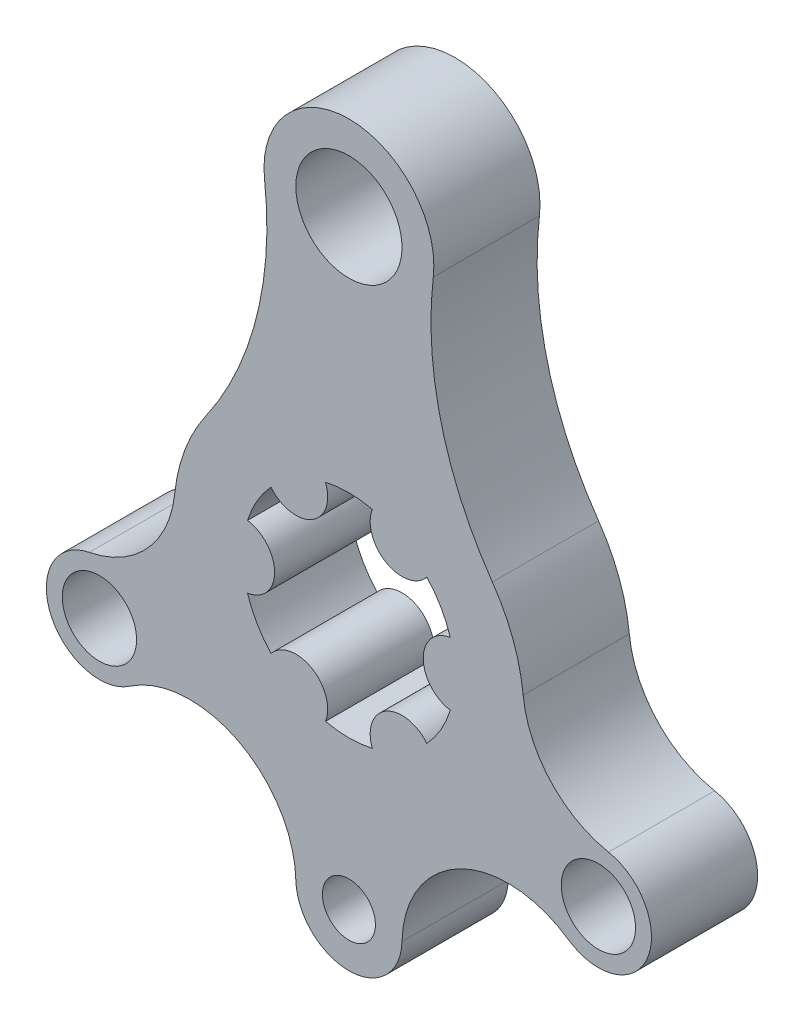
ISO-10303-21;
HEADER;
FILE_DESCRIPTION(('STEP AP214'),'2;1');
FILE_NAME('part.step','',(''),(''),'','','');
FILE_SCHEMA(('AUTOMOTIVE_DESIGN { 1 0 10303 214 1 1 1 1 }'));
ENDSEC;
DATA;
#1=APPLICATION_CONTEXT('core data for automotive mechanical design processes');
#2=APPLICATION_PROTOCOL_DEFINITION('international standard','automotive_design',2000,#1);
#3=PRODUCT_CONTEXT('',#1,'mechanical');
#4=PRODUCT('Part','Part','',(#3));
#5=PRODUCT_RELATED_PRODUCT_CATEGORY('part','',(#4));
#6=PRODUCT_DEFINITION_FORMATION('','',#4);
#7=PRODUCT_DEFINITION_CONTEXT('part definition',#1,'design');
#8=PRODUCT_DEFINITION('design','',#6,#7);
#9=PRODUCT_DEFINITION_SHAPE('','',#8);
#10=(LENGTH_UNIT() NAMED_UNIT(*) SI_UNIT(.MILLI.,.METRE.));
#11=(NAMED_UNIT(*) PLANE_ANGLE_UNIT() SI_UNIT($,.RADIAN.));
#12=(NAMED_UNIT(*) SI_UNIT($,.STERADIAN.) SOLID_ANGLE_UNIT());
#13=UNCERTAINTY_MEASURE_WITH_UNIT(LENGTH_MEASURE(1.E-05),#10,'distance_accuracy_value','');
#14=(GEOMETRIC_REPRESENTATION_CONTEXT(3) GLOBAL_UNCERTAINTY_ASSIGNED_CONTEXT((#13)) GLOBAL_UNIT_ASSIGNED_CONTEXT((#10,
#11,#12)) REPRESENTATION_CONTEXT('',''));
#15=CARTESIAN_POINT('',(0.,0.,0.));
#16=DIRECTION('',(0.,0.,1.));
#17=DIRECTION('',(1.,0.,0.));
#18=AXIS2_PLACEMENT_3D('',#15,#16,#17);
#19=CARTESIAN_POINT('',(0.,-48.,-20.));
#20=DIRECTION('',(0.,0.,1.));
#21=DIRECTION('',(1.,0.,0.));
#22=AXIS2_PLACEMENT_3D('',#19,#20,#21);
#23=CYLINDRICAL_SURFACE('',#22,10.);
#24=CARTESIAN_POINT('',(0.,-48.,0.));
#25=DIRECTION('',(0.,0.,1.));
#26=DIRECTION('',(1.,0.,0.));
#27=AXIS2_PLACEMENT_3D('',#24,#25,#26);
#28=CIRCLE('',#27,10.);
#29=CARTESIAN_POINT('',(-9.99717857083281,-48.2375302567698,0.));
#30=VERTEX_POINT('',#29);
#31=CARTESIAN_POINT('',(9.99717857083281,-48.2375302567698,0.));
#32=VERTEX_POINT('',#31);
#33=EDGE_CURVE('E349',#30,#32,#28,.T.);
#34=ORIENTED_EDGE('',*,*,#33,.F.);
#35=DIRECTION('',(0.,0.,1.));
#36=VECTOR('',#35,1.);
#37=CARTESIAN_POINT('',(-9.99717857083281,-48.2375302567698,-20.));
#38=LINE('',#37,#36);
#39=CARTESIAN_POINT('',(-9.99717857083281,-48.2375302567698,-20.));
#40=VERTEX_POINT('',#39);
#41=EDGE_CURVE('E11',#40,#30,#38,.T.);
#42=ORIENTED_EDGE('',*,*,#41,.F.);
#43=CARTESIAN_POINT('',(0.,-48.,-20.));
#44=DIRECTION('',(0.,0.,1.));
#45=DIRECTION('',(1.,0.,0.));
#46=AXIS2_PLACEMENT_3D('',#43,#44,#45);
#47=CIRCLE('',#46,10.);
#48=CARTESIAN_POINT('',(9.99717857083281,-48.2375302567698,-20.));
#49=VERTEX_POINT('',#48);
#50=EDGE_CURVE('E304',#40,#49,#47,.T.);
#51=ORIENTED_EDGE('',*,*,#50,.T.);
#52=DIRECTION('',(0.,0.,1.));
#53=VECTOR('',#52,1.);
#54=CARTESIAN_POINT('',(9.99717857083281,-48.2375302567698,-20.));
#55=LINE('',#54,#53);
#56=EDGE_CURVE('E48',#49,#32,#55,.T.);
#57=ORIENTED_EDGE('',*,*,#56,.T.);
#58=EDGE_LOOP('',(#34,#42,#51,#57));
#59=FACE_BOUND('',#58,.T.);
#60=ADVANCED_FACE('F45',(#59),#23,.T.);
#61=CARTESIAN_POINT('',(-29.9915357124985,-48.7125907703095,-20.));
#62=DIRECTION('',(0.,0.,1.));
#63=DIRECTION('',(1.,0.,0.));
#64=AXIS2_PLACEMENT_3D('',#61,#62,#63);
#65=CYLINDRICAL_SURFACE('',#64,20.);
#66=CARTESIAN_POINT('',(-29.9915357124985,-48.7125907703095,0.));
#67=DIRECTION('',(0.,0.,1.));
#68=DIRECTION('',(1.,0.,0.));
#69=AXIS2_PLACEMENT_3D('',#66,#67,#68);
#70=CIRCLE('',#69,20.);
#71=CARTESIAN_POINT('',(-41.3305119041661,-32.2375302567698,0.));
#72=VERTEX_POINT('',#71);
#73=EDGE_CURVE('E309',#30,#72,#70,.T.);
#74=ORIENTED_EDGE('',*,*,#73,.T.);
#75=DIRECTION('',(0.,0.,1.));
#76=VECTOR('',#75,1.);
#77=CARTESIAN_POINT('',(-41.3305119041661,-32.2375302567698,-20.));
#78=LINE('',#77,#76);
#79=CARTESIAN_POINT('',(-41.3305119041661,-32.2375302567698,-20.));
#80=VERTEX_POINT('',#79);
#81=EDGE_CURVE('E54',#80,#72,#78,.T.);
#82=ORIENTED_EDGE('',*,*,#81,.F.);
#83=CARTESIAN_POINT('',(-29.9915357124985,-48.7125907703095,-20.));
#84=DIRECTION('',(0.,0.,1.));
#85=DIRECTION('',(1.,0.,0.));
#86=AXIS2_PLACEMENT_3D('',#83,#84,#85);
#87=CIRCLE('',#86,20.);
#88=EDGE_CURVE('E346',#40,#80,#87,.T.);
#89=ORIENTED_EDGE('',*,*,#88,.F.);
#90=ORIENTED_EDGE('',*,*,#41,.T.);
#91=EDGE_LOOP('',(#74,#82,#89,#90));
#92=FACE_BOUND('',#91,.T.);
#93=ADVANCED_FACE('F441',(#92),#65,.F.);
#94=CARTESIAN_POINT('',(-47.,-24.,-20.));
#95=DIRECTION('',(0.,0.,1.));
#96=DIRECTION('',(1.,0.,0.));
#97=AXIS2_PLACEMENT_3D('',#94,#95,#96);
#98=CYLINDRICAL_SURFACE('',#97,10.);
#99=CARTESIAN_POINT('',(-47.,-24.,0.));
#100=DIRECTION('',(0.,0.,1.));
#101=DIRECTION('',(1.,0.,0.));
#102=AXIS2_PLACEMENT_3D('',#99,#100,#101);
#103=CIRCLE('',#102,10.);
#104=CARTESIAN_POINT('',(-48.90635362544,-14.1833908168466,0.));
#105=VERTEX_POINT('',#104);
#106=EDGE_CURVE('E390',#105,#72,#103,.T.);
#107=ORIENTED_EDGE('',*,*,#106,.F.);
#108=DIRECTION('',(0.,0.,1.));
#109=VECTOR('',#108,1.);
#110=CARTESIAN_POINT('',(-48.90635362544,-14.1833908168466,-20.));
#111=LINE('',#110,#109);
#112=CARTESIAN_POINT('',(-48.90635362544,-14.1833908168466,-20.));
#113=VERTEX_POINT('',#112);
#114=EDGE_CURVE('E399',#113,#105,#111,.T.);
#115=ORIENTED_EDGE('',*,*,#114,.F.);
#116=CARTESIAN_POINT('',(-47.,-24.,-20.));
#117=DIRECTION('',(0.,0.,1.));
#118=DIRECTION('',(1.,0.,0.));
#119=AXIS2_PLACEMENT_3D('',#116,#117,#118);
#120=CIRCLE('',#119,10.);
#121=EDGE_CURVE('E342',#113,#80,#120,.T.);
#122=ORIENTED_EDGE('',*,*,#121,.T.);
#123=ORIENTED_EDGE('',*,*,#81,.T.);
#124=EDGE_LOOP('',(#107,#115,#122,#123));
#125=FACE_BOUND('',#124,.T.);
#126=ADVANCED_FACE('F478',(#125),#98,.T.);
#127=CARTESIAN_POINT('',(-52.7190608763201,5.44982754946019,-20.));
#128=DIRECTION('',(0.,0.,1.));
#129=DIRECTION('',(1.,0.,0.));
#130=AXIS2_PLACEMENT_3D('',#127,#128,#129);
#131=CYLINDRICAL_SURFACE('',#130,20.);
#132=CARTESIAN_POINT('',(-52.7190608763201,5.44982754946019,0.));
#133=DIRECTION('',(0.,0.,1.));
#134=DIRECTION('',(1.,0.,0.));
#135=AXIS2_PLACEMENT_3D('',#132,#133,#134);
#136=CIRCLE('',#135,20.);
#137=CARTESIAN_POINT('',(-32.8250756399729,3.39328885155069,0.));
#138=VERTEX_POINT('',#137);
#139=EDGE_CURVE('E386',#105,#138,#136,.T.);
#140=ORIENTED_EDGE('',*,*,#139,.T.);
#141=DIRECTION('',(0.,0.,1.));
#142=VECTOR('',#141,1.);
#143=CARTESIAN_POINT('',(-32.8250756399729,3.39328885155069,-20.));
#144=LINE('',#143,#142);
#145=CARTESIAN_POINT('',(-32.8250756399729,3.39328885155069,-20.));
#146=VERTEX_POINT('',#145);
#147=EDGE_CURVE('E402',#146,#138,#144,.T.);
#148=ORIENTED_EDGE('',*,*,#147,.F.);
#149=CARTESIAN_POINT('',(-52.7190608763201,5.44982754946019,-20.));
#150=DIRECTION('',(0.,0.,1.));
#151=DIRECTION('',(1.,0.,0.));
#152=AXIS2_PLACEMENT_3D('',#149,#150,#151);
#153=CIRCLE('',#152,20.);
#154=EDGE_CURVE('E339',#113,#146,#153,.T.);
#155=ORIENTED_EDGE('',*,*,#154,.F.);
#156=ORIENTED_EDGE('',*,*,#114,.T.);
#157=EDGE_LOOP('',(#140,#148,#155,#156));
#158=FACE_BOUND('',#157,.T.);
#159=ADVANCED_FACE('F476',(#158),#131,.F.);
#160=CARTESIAN_POINT('',(0.,0.,-20.));
#161=DIRECTION('',(0.,0.,1.));
#162=DIRECTION('',(1.,0.,0.));
#163=AXIS2_PLACEMENT_3D('',#160,#161,#162);
#164=CYLINDRICAL_SURFACE('',#163,33.);
#165=CARTESIAN_POINT('',(0.,0.,0.));
#166=DIRECTION('',(0.,0.,1.));
#167=DIRECTION('',(1.,0.,0.));
#168=AXIS2_PLACEMENT_3D('',#165,#166,#167);
#169=CIRCLE('',#168,33.);
#170=CARTESIAN_POINT('',(-27.0298161974661,18.931165741475,0.));
#171=VERTEX_POINT('',#170);
#172=EDGE_CURVE('E382',#171,#138,#169,.T.);
#173=ORIENTED_EDGE('',*,*,#172,.F.);
#174=DIRECTION('',(0.,0.,1.));
#175=VECTOR('',#174,1.);
#176=CARTESIAN_POINT('',(-27.0298161974661,18.931165741475,-20.));
#177=LINE('',#176,#175);
#178=CARTESIAN_POINT('',(-27.0298161974661,18.931165741475,-20.));
#179=VERTEX_POINT('',#178);
#180=EDGE_CURVE('E405',#179,#171,#177,.T.);
#181=ORIENTED_EDGE('',*,*,#180,.F.);
#182=CARTESIAN_POINT('',(0.,0.,-20.));
#183=DIRECTION('',(0.,0.,1.));
#184=DIRECTION('',(1.,0.,0.));
#185=AXIS2_PLACEMENT_3D('',#182,#183,#184);
#186=CIRCLE('',#185,33.);
#187=EDGE_CURVE('E335',#179,#146,#186,.T.);
#188=ORIENTED_EDGE('',*,*,#187,.T.);
#189=ORIENTED_EDGE('',*,*,#147,.T.);
#190=EDGE_LOOP('',(#173,#181,#188,#189));
#191=FACE_BOUND('',#190,.T.);
#192=ADVANCED_FACE('F471',(#191),#164,.T.);
#193=CARTESIAN_POINT('',(-79.4512779137641,55.6461538461538,-20.));
#194=DIRECTION('',(0.,0.,1.));
#195=DIRECTION('',(1.,0.,0.));
#196=AXIS2_PLACEMENT_3D('',#193,#194,#195);
#197=CYLINDRICAL_SURFACE('',#196,64.);
#198=CARTESIAN_POINT('',(-79.4512779137641,55.6461538461538,0.));
#199=DIRECTION('',(0.,0.,1.));
#200=DIRECTION('',(1.,0.,0.));
#201=AXIS2_PLACEMENT_3D('',#198,#199,#200);
#202=CIRCLE('',#201,64.);
#203=CARTESIAN_POINT('',(-15.8902555827528,63.1292307692308,0.));
#204=VERTEX_POINT('',#203);
#205=EDGE_CURVE('E378',#171,#204,#202,.T.);
#206=ORIENTED_EDGE('',*,*,#205,.T.);
#207=DIRECTION('',(0.,0.,1.));
#208=VECTOR('',#207,1.);
#209=CARTESIAN_POINT('',(-15.8902555827528,63.1292307692308,-20.));
#210=LINE('',#209,#208);
#211=CARTESIAN_POINT('',(-15.8902555827528,63.1292307692308,-20.));
#212=VERTEX_POINT('',#211);
#213=EDGE_CURVE('E408',#212,#204,#210,.T.);
#214=ORIENTED_EDGE('',*,*,#213,.F.);
#215=CARTESIAN_POINT('',(-79.4512779137641,55.6461538461538,-20.));
#216=DIRECTION('',(0.,0.,1.));
#217=DIRECTION('',(1.,0.,0.));
#218=AXIS2_PLACEMENT_3D('',#215,#216,#217);
#219=CIRCLE('',#218,64.);
#220=EDGE_CURVE('E332',#179,#212,#219,.T.);
#221=ORIENTED_EDGE('',*,*,#220,.F.);
#222=ORIENTED_EDGE('',*,*,#180,.T.);
#223=EDGE_LOOP('',(#206,#214,#221,#222));
#224=FACE_BOUND('',#223,.T.);
#225=ADVANCED_FACE('F468',(#224),#197,.F.);
#226=CARTESIAN_POINT('',(0.,65.,-20.));
#227=DIRECTION('',(0.,0.,1.));
#228=DIRECTION('',(1.,0.,0.));
#229=AXIS2_PLACEMENT_3D('',#226,#227,#228);
#230=CYLINDRICAL_SURFACE('',#229,16.);
#231=CARTESIAN_POINT('',(0.,65.,0.));
#232=DIRECTION('',(0.,0.,1.));
#233=DIRECTION('',(1.,0.,0.));
#234=AXIS2_PLACEMENT_3D('',#231,#232,#233);
#235=CIRCLE('',#234,16.);
#236=CARTESIAN_POINT('',(15.8902555827528,63.1292307692308,0.));
#237=VERTEX_POINT('',#236);
#238=EDGE_CURVE('E374',#237,#204,#235,.T.);
#239=ORIENTED_EDGE('',*,*,#238,.F.);
#240=DIRECTION('',(0.,0.,1.));
#241=VECTOR('',#240,1.);
#242=CARTESIAN_POINT('',(15.8902555827528,63.1292307692308,-20.));
#243=LINE('',#242,#241);
#244=CARTESIAN_POINT('',(15.8902555827528,63.1292307692308,-20.));
#245=VERTEX_POINT('',#244);
#246=EDGE_CURVE('E411',#245,#237,#243,.T.);
#247=ORIENTED_EDGE('',*,*,#246,.F.);
#248=CARTESIAN_POINT('',(0.,65.,-20.));
#249=DIRECTION('',(0.,0.,1.));
#250=DIRECTION('',(1.,0.,0.));
#251=AXIS2_PLACEMENT_3D('',#248,#249,#250);
#252=CIRCLE('',#251,16.);
#253=EDGE_CURVE('E328',#245,#212,#252,.T.);
#254=ORIENTED_EDGE('',*,*,#253,.T.);
#255=ORIENTED_EDGE('',*,*,#213,.T.);
#256=EDGE_LOOP('',(#239,#247,#254,#255));
#257=FACE_BOUND('',#256,.T.);
#258=ADVANCED_FACE('F464',(#257),#230,.T.);
#259=CARTESIAN_POINT('',(79.4512779137641,55.6461538461538,-20.));
#260=DIRECTION('',(0.,0.,1.));
#261=DIRECTION('',(1.,0.,0.));
#262=AXIS2_PLACEMENT_3D('',#259,#260,#261);
#263=CYLINDRICAL_SURFACE('',#262,64.);
#264=CARTESIAN_POINT('',(79.4512779137641,55.6461538461538,0.));
#265=DIRECTION('',(0.,0.,-1.));
#266=DIRECTION('',(-1.,0.,0.));
#267=AXIS2_PLACEMENT_3D('',#264,#265,#266);
#268=CIRCLE('',#267,64.);
#269=CARTESIAN_POINT('',(27.0298161974661,18.931165741475,0.));
#270=VERTEX_POINT('',#269);
#271=EDGE_CURVE('E370',#270,#237,#268,.T.);
#272=ORIENTED_EDGE('',*,*,#271,.F.);
#273=DIRECTION('',(0.,0.,1.));
#274=VECTOR('',#273,1.);
#275=CARTESIAN_POINT('',(27.0298161974661,18.931165741475,-20.));
#276=LINE('',#275,#274);
#277=CARTESIAN_POINT('',(27.0298161974661,18.931165741475,-20.));
#278=VERTEX_POINT('',#277);
#279=EDGE_CURVE('E414',#278,#270,#276,.T.);
#280=ORIENTED_EDGE('',*,*,#279,.F.);
#281=CARTESIAN_POINT('',(79.4512779137641,55.6461538461538,-20.));
#282=DIRECTION('',(0.,0.,-1.));
#283=DIRECTION('',(-1.,0.,0.));
#284=AXIS2_PLACEMENT_3D('',#281,#282,#283);
#285=CIRCLE('',#284,64.);
#286=EDGE_CURVE('E324',#278,#245,#285,.T.);
#287=ORIENTED_EDGE('',*,*,#286,.T.);
#288=ORIENTED_EDGE('',*,*,#246,.T.);
#289=EDGE_LOOP('',(#272,#280,#287,#288));
#290=FACE_BOUND('',#289,.T.);
#291=ADVANCED_FACE('F460',(#290),#263,.F.);
#292=CARTESIAN_POINT('',(0.,0.,-20.));
#293=DIRECTION('',(0.,0.,1.));
#294=DIRECTION('',(1.,0.,0.));
#295=AXIS2_PLACEMENT_3D('',#292,#293,#294);
#296=CYLINDRICAL_SURFACE('',#295,33.);
#297=CARTESIAN_POINT('',(0.,0.,0.));
#298=DIRECTION('',(0.,0.,1.));
#299=DIRECTION('',(1.,0.,0.));
#300=AXIS2_PLACEMENT_3D('',#297,#298,#299);
#301=CIRCLE('',#300,33.);
#302=CARTESIAN_POINT('',(32.8250756399729,3.39328885155068,0.));
#303=VERTEX_POINT('',#302);
#304=EDGE_CURVE('E366',#303,#270,#301,.T.);
#305=ORIENTED_EDGE('',*,*,#304,.F.);
#306=DIRECTION('',(0.,0.,1.));
#307=VECTOR('',#306,1.);
#308=CARTESIAN_POINT('',(32.8250756399729,3.39328885155068,-20.));
#309=LINE('',#308,#307);
#310=CARTESIAN_POINT('',(32.8250756399729,3.39328885155068,-20.));
#311=VERTEX_POINT('',#310);
#312=EDGE_CURVE('E417',#311,#303,#309,.T.);
#313=ORIENTED_EDGE('',*,*,#312,.F.);
#314=CARTESIAN_POINT('',(0.,0.,-20.));
#315=DIRECTION('',(0.,0.,1.));
#316=DIRECTION('',(1.,0.,0.));
#317=AXIS2_PLACEMENT_3D('',#314,#315,#316);
#318=CIRCLE('',#317,33.);
#319=EDGE_CURVE('E320',#311,#278,#318,.T.);
#320=ORIENTED_EDGE('',*,*,#319,.T.);
#321=ORIENTED_EDGE('',*,*,#279,.T.);
#322=EDGE_LOOP('',(#305,#313,#320,#321));
#323=FACE_BOUND('',#322,.T.);
#324=ADVANCED_FACE('F455',(#323),#296,.T.);
#325=CARTESIAN_POINT('',(52.7190608763201,5.44982754946019,-20.));
#326=DIRECTION('',(0.,0.,1.));
#327=DIRECTION('',(1.,0.,0.));
#328=AXIS2_PLACEMENT_3D('',#325,#326,#327);
#329=CYLINDRICAL_SURFACE('',#328,20.);
#330=CARTESIAN_POINT('',(52.7190608763201,5.44982754946019,0.));
#331=DIRECTION('',(0.,0.,-1.));
#332=DIRECTION('',(-1.,0.,0.));
#333=AXIS2_PLACEMENT_3D('',#330,#331,#332);
#334=CIRCLE('',#333,20.);
#335=CARTESIAN_POINT('',(48.90635362544,-14.1833908168466,0.));
#336=VERTEX_POINT('',#335);
#337=EDGE_CURVE('E362',#336,#303,#334,.T.);
#338=ORIENTED_EDGE('',*,*,#337,.F.);
#339=DIRECTION('',(0.,0.,1.));
#340=VECTOR('',#339,1.);
#341=CARTESIAN_POINT('',(48.90635362544,-14.1833908168466,-20.));
#342=LINE('',#341,#340);
#343=CARTESIAN_POINT('',(48.90635362544,-14.1833908168466,-20.));
#344=VERTEX_POINT('',#343);
#345=EDGE_CURVE('E420',#344,#336,#342,.T.);
#346=ORIENTED_EDGE('',*,*,#345,.F.);
#347=CARTESIAN_POINT('',(52.7190608763201,5.44982754946019,-20.));
#348=DIRECTION('',(0.,0.,-1.));
#349=DIRECTION('',(-1.,0.,0.));
#350=AXIS2_PLACEMENT_3D('',#347,#348,#349);
#351=CIRCLE('',#350,20.);
#352=EDGE_CURVE('E316',#344,#311,#351,.T.);
#353=ORIENTED_EDGE('',*,*,#352,.T.);
#354=ORIENTED_EDGE('',*,*,#312,.T.);
#355=EDGE_LOOP('',(#338,#346,#353,#354));
#356=FACE_BOUND('',#355,.T.);
#357=ADVANCED_FACE('F452',(#356),#329,.F.);
#358=CARTESIAN_POINT('',(47.,-24.,-20.));
#359=DIRECTION('',(0.,0.,1.));
#360=DIRECTION('',(1.,0.,0.));
#361=AXIS2_PLACEMENT_3D('',#358,#359,#360);
#362=CYLINDRICAL_SURFACE('',#361,10.);
#363=CARTESIAN_POINT('',(47.,-24.,0.));
#364=DIRECTION('',(0.,0.,-1.));
#365=DIRECTION('',(-1.,0.,0.));
#366=AXIS2_PLACEMENT_3D('',#363,#364,#365);
#367=CIRCLE('',#366,10.);
#368=CARTESIAN_POINT('',(41.3305119041662,-32.2375302567698,0.));
#369=VERTEX_POINT('',#368);
#370=EDGE_CURVE('E358',#336,#369,#367,.T.);
#371=ORIENTED_EDGE('',*,*,#370,.T.);
#372=DIRECTION('',(0.,0.,1.));
#373=VECTOR('',#372,1.);
#374=CARTESIAN_POINT('',(41.3305119041662,-32.2375302567698,-20.));
#375=LINE('',#374,#373);
#376=CARTESIAN_POINT('',(41.3305119041662,-32.2375302567698,-20.));
#377=VERTEX_POINT('',#376);
#378=EDGE_CURVE('E422',#377,#369,#375,.T.);
#379=ORIENTED_EDGE('',*,*,#378,.F.);
#380=CARTESIAN_POINT('',(47.,-24.,-20.));
#381=DIRECTION('',(0.,0.,-1.));
#382=DIRECTION('',(-1.,0.,0.));
#383=AXIS2_PLACEMENT_3D('',#380,#381,#382);
#384=CIRCLE('',#383,10.);
#385=EDGE_CURVE('E313',#344,#377,#384,.T.);
#386=ORIENTED_EDGE('',*,*,#385,.F.);
#387=ORIENTED_EDGE('',*,*,#345,.T.);
#388=EDGE_LOOP('',(#371,#379,#386,#387));
#389=FACE_BOUND('',#388,.T.);
#390=ADVANCED_FACE('F449',(#389),#362,.T.);
#391=CARTESIAN_POINT('',(29.9915357124985,-48.7125907703095,-20.));
#392=DIRECTION('',(0.,0.,1.));
#393=DIRECTION('',(1.,0.,0.));
#394=AXIS2_PLACEMENT_3D('',#391,#392,#393);
#395=CYLINDRICAL_SURFACE('',#394,20.);
#396=CARTESIAN_POINT('',(29.9915357124985,-48.7125907703095,0.));
#397=DIRECTION('',(0.,0.,-1.));
#398=DIRECTION('',(-1.,0.,0.));
#399=AXIS2_PLACEMENT_3D('',#396,#397,#398);
#400=CIRCLE('',#399,20.);
#401=EDGE_CURVE('E353',#32,#369,#400,.T.);
#402=ORIENTED_EDGE('',*,*,#401,.F.);
#403=ORIENTED_EDGE('',*,*,#56,.F.);
#404=CARTESIAN_POINT('',(29.9915357124985,-48.7125907703095,-20.));
#405=DIRECTION('',(0.,0.,-1.));
#406=DIRECTION('',(-1.,0.,0.));
#407=AXIS2_PLACEMENT_3D('',#404,#405,#406);
#408=CIRCLE('',#407,20.);
#409=EDGE_CURVE('E308',#49,#377,#408,.T.);
#410=ORIENTED_EDGE('',*,*,#409,.T.);
#411=ORIENTED_EDGE('',*,*,#378,.T.);
#412=EDGE_LOOP('',(#402,#403,#410,#411));
#413=FACE_BOUND('',#412,.T.);
#414=ADVANCED_FACE('F432',(#413),#395,.F.);
#415=CARTESIAN_POINT('',(14.9957678562492,-48.3562953851547,-20.));
#416=DIRECTION('',(0.,0.,1.));
#417=DIRECTION('',(1.,0.,0.));
#418=AXIS2_PLACEMENT_3D('',#415,#416,#417);
#419=PLANE('',#418);
#420=CARTESIAN_POINT('',(0.,65.,-20.));
#421=DIRECTION('',(0.,0.,-1.));
#422=DIRECTION('',(-1.,0.,0.));
#423=AXIS2_PLACEMENT_3D('',#420,#421,#422);
#424=CIRCLE('',#423,10.);
#425=CARTESIAN_POINT('',(-10.,65.,-20.));
#426=VERTEX_POINT('',#425);
#427=EDGE_CURVE('E291',#426,#426,#424,.T.);
#428=ORIENTED_EDGE('',*,*,#427,.F.);
#429=EDGE_LOOP('',(#428));
#430=FACE_BOUND('',#429,.T.);
#431=CARTESIAN_POINT('',(-10.,17.3205080756888,-20.));
#432=DIRECTION('',(0.,0.,1.));
#433=DIRECTION('',(-1.,0.,0.));
#434=AXIS2_PLACEMENT_3D('',#431,#432,#433);
#435=CIRCLE('',#434,6.00000000000001);
#436=CARTESIAN_POINT('',(-14.6873631368631,13.57502722229,-20.));
#437=VERTEX_POINT('',#436);
#438=CARTESIAN_POINT('',(-4.41263686313689,19.5071432022756,-20.));
#439=VERTEX_POINT('',#438);
#440=EDGE_CURVE('E230',#437,#439,#435,.T.);
#441=ORIENTED_EDGE('',*,*,#440,.F.);
#442=CARTESIAN_POINT('',(0.,0.,-20.));
#443=DIRECTION('',(0.,0.,-1.));
#444=DIRECTION('',(-1.,0.,0.));
#445=AXIS2_PLACEMENT_3D('',#442,#443,#444);
#446=CIRCLE('',#445,20.);
#447=CARTESIAN_POINT('',(-19.1,5.93211597998555,-20.));
#448=VERTEX_POINT('',#447);
#449=EDGE_CURVE('E62',#448,#437,#446,.T.);
#450=ORIENTED_EDGE('',*,*,#449,.F.);
#451=CARTESIAN_POINT('',(-20.,0.,-20.));
#452=DIRECTION('',(0.,0.,1.));
#453=DIRECTION('',(-1.,0.,0.));
#454=AXIS2_PLACEMENT_3D('',#451,#452,#453);
#455=CIRCLE('',#454,5.99999999999999);
#456=CARTESIAN_POINT('',(-19.1,-5.93211597998556,-20.));
#457=VERTEX_POINT('',#456);
#458=EDGE_CURVE('E217',#457,#448,#455,.T.);
#459=ORIENTED_EDGE('',*,*,#458,.F.);
#460=CARTESIAN_POINT('',(0.,0.,-20.));
#461=DIRECTION('',(0.,0.,-1.));
#462=DIRECTION('',(-1.,0.,0.));
#463=AXIS2_PLACEMENT_3D('',#460,#461,#462);
#464=CIRCLE('',#463,20.);
#465=CARTESIAN_POINT('',(-14.6873631368631,-13.57502722229,-20.));
#466=VERTEX_POINT('',#465);
#467=EDGE_CURVE('E223',#466,#457,#464,.T.);
#468=ORIENTED_EDGE('',*,*,#467,.F.);
#469=CARTESIAN_POINT('',(-10.,-17.3205080756888,-20.));
#470=DIRECTION('',(0.,0.,1.));
#471=DIRECTION('',(-1.,0.,0.));
#472=AXIS2_PLACEMENT_3D('',#469,#470,#471);
#473=CIRCLE('',#472,6.);
#474=CARTESIAN_POINT('',(-4.41263686313688,-19.5071432022756,-20.));
#475=VERTEX_POINT('',#474);
#476=EDGE_CURVE('E791',#475,#466,#473,.T.);
#477=ORIENTED_EDGE('',*,*,#476,.F.);
#478=CARTESIAN_POINT('',(0.,0.,-20.));
#479=DIRECTION('',(0.,0.,-1.));
#480=DIRECTION('',(-1.,0.,0.));
#481=AXIS2_PLACEMENT_3D('',#478,#479,#480);
#482=CIRCLE('',#481,20.);
#483=CARTESIAN_POINT('',(4.41263686313688,-19.5071432022756,-20.));
#484=VERTEX_POINT('',#483);
#485=EDGE_CURVE('E795',#484,#475,#482,.T.);
#486=ORIENTED_EDGE('',*,*,#485,.F.);
#487=CARTESIAN_POINT('',(10.,-17.3205080756888,-20.));
#488=DIRECTION('',(0.,0.,1.));
#489=DIRECTION('',(-1.,0.,0.));
#490=AXIS2_PLACEMENT_3D('',#487,#488,#489);
#491=CIRCLE('',#490,6.);
#492=CARTESIAN_POINT('',(14.6873631368631,-13.57502722229,-20.));
#493=VERTEX_POINT('',#492);
#494=EDGE_CURVE('E799',#493,#484,#491,.T.);
#495=ORIENTED_EDGE('',*,*,#494,.F.);
#496=CARTESIAN_POINT('',(0.,0.,-20.));
#497=DIRECTION('',(0.,0.,-1.));
#498=DIRECTION('',(-1.,0.,0.));
#499=AXIS2_PLACEMENT_3D('',#496,#497,#498);
#500=CIRCLE('',#499,20.);
#501=CARTESIAN_POINT('',(19.1,-5.93211597998557,-20.));
#502=VERTEX_POINT('',#501);
#503=EDGE_CURVE('E803',#502,#493,#500,.T.);
#504=ORIENTED_EDGE('',*,*,#503,.F.);
#505=CARTESIAN_POINT('',(20.,0.,-20.));
#506=DIRECTION('',(0.,0.,1.));
#507=DIRECTION('',(-1.,0.,0.));
#508=AXIS2_PLACEMENT_3D('',#505,#506,#507);
#509=CIRCLE('',#508,6.00000000000001);
#510=CARTESIAN_POINT('',(19.1,5.93211597998557,-20.));
#511=VERTEX_POINT('',#510);
#512=EDGE_CURVE('E807',#511,#502,#509,.T.);
#513=ORIENTED_EDGE('',*,*,#512,.F.);
#514=CARTESIAN_POINT('',(0.,0.,-20.));
#515=DIRECTION('',(0.,0.,-1.));
#516=DIRECTION('',(-1.,0.,0.));
#517=AXIS2_PLACEMENT_3D('',#514,#515,#516);
#518=CIRCLE('',#517,20.);
#519=CARTESIAN_POINT('',(14.6873631368631,13.57502722229,-20.));
#520=VERTEX_POINT('',#519);
#521=EDGE_CURVE('E811',#520,#511,#518,.T.);
#522=ORIENTED_EDGE('',*,*,#521,.F.);
#523=CARTESIAN_POINT('',(10.,17.3205080756888,-20.));
#524=DIRECTION('',(0.,0.,1.));
#525=DIRECTION('',(-1.,0.,0.));
#526=AXIS2_PLACEMENT_3D('',#523,#524,#525);
#527=CIRCLE('',#526,6.00000000000001);
#528=CARTESIAN_POINT('',(4.41263686313689,19.5071432022756,-20.));
#529=VERTEX_POINT('',#528);
#530=EDGE_CURVE('E815',#529,#520,#527,.T.);
#531=ORIENTED_EDGE('',*,*,#530,.F.);
#532=CARTESIAN_POINT('',(0.,0.,-20.));
#533=DIRECTION('',(0.,0.,-1.));
#534=DIRECTION('',(-1.,0.,0.));
#535=AXIS2_PLACEMENT_3D('',#532,#533,#534);
#536=CIRCLE('',#535,20.);
#537=EDGE_CURVE('E239',#439,#529,#536,.T.);
#538=ORIENTED_EDGE('',*,*,#537,.F.);
#539=EDGE_LOOP('',(#441,#450,#459,#468,#477,#486,#495,#504,#513,#522,#531,#538));
#540=FACE_BOUND('',#539,.T.);
#541=CARTESIAN_POINT('',(47.,-24.,-20.));
#542=DIRECTION('',(0.,0.,-1.));
#543=DIRECTION('',(-1.,0.,0.));
#544=AXIS2_PLACEMENT_3D('',#541,#542,#543);
#545=CIRCLE('',#544,7.);
#546=CARTESIAN_POINT('',(40.,-24.,-20.));
#547=VERTEX_POINT('',#546);
#548=EDGE_CURVE('E237',#547,#547,#545,.T.);
#549=ORIENTED_EDGE('',*,*,#548,.F.);
#550=EDGE_LOOP('',(#549));
#551=FACE_BOUND('',#550,.T.);
#552=CARTESIAN_POINT('',(0.,-48.,-20.));
#553=DIRECTION('',(0.,0.,-1.));
#554=DIRECTION('',(-1.,0.,0.));
#555=AXIS2_PLACEMENT_3D('',#552,#553,#554);
#556=CIRCLE('',#555,5.);
#557=CARTESIAN_POINT('',(-5.,-48.,-20.));
#558=VERTEX_POINT('',#557);
#559=EDGE_CURVE('E296',#558,#558,#556,.T.);
#560=ORIENTED_EDGE('',*,*,#559,.F.);
#561=EDGE_LOOP('',(#560));
#562=FACE_BOUND('',#561,.T.);
#563=CARTESIAN_POINT('',(-47.,-24.,-20.));
#564=DIRECTION('',(0.,0.,-1.));
#565=DIRECTION('',(-1.,0.,0.));
#566=AXIS2_PLACEMENT_3D('',#563,#564,#565);
#567=CIRCLE('',#566,7.);
#568=CARTESIAN_POINT('',(-54.,-24.,-20.));
#569=VERTEX_POINT('',#568);
#570=EDGE_CURVE('E287',#569,#569,#567,.T.);
#571=ORIENTED_EDGE('',*,*,#570,.F.);
#572=EDGE_LOOP('',(#571));
#573=FACE_BOUND('',#572,.T.);
#574=ORIENTED_EDGE('',*,*,#50,.F.);
#575=ORIENTED_EDGE('',*,*,#88,.T.);
#576=ORIENTED_EDGE('',*,*,#121,.F.);
#577=ORIENTED_EDGE('',*,*,#154,.T.);
#578=ORIENTED_EDGE('',*,*,#187,.F.);
#579=ORIENTED_EDGE('',*,*,#220,.T.);
#580=ORIENTED_EDGE('',*,*,#253,.F.);
#581=ORIENTED_EDGE('',*,*,#286,.F.);
#582=ORIENTED_EDGE('',*,*,#319,.F.);
#583=ORIENTED_EDGE('',*,*,#352,.F.);
#584=ORIENTED_EDGE('',*,*,#385,.T.);
#585=ORIENTED_EDGE('',*,*,#409,.F.);
#586=EDGE_LOOP('',(#574,#575,#576,#577,#578,#579,#580,#581,#582,#583,#584,#585));
#587=FACE_BOUND('',#586,.T.);
#588=ADVANCED_FACE('F226',(#430,#540,#551,#562,#573,#587),#419,.F.);
#589=CARTESIAN_POINT('',(14.9957678562492,-48.3562953851547,0.));
#590=DIRECTION('',(0.,0.,1.));
#591=DIRECTION('',(1.,0.,0.));
#592=AXIS2_PLACEMENT_3D('',#589,#590,#591);
#593=PLANE('',#592);
#594=CARTESIAN_POINT('',(0.,65.,0.));
#595=DIRECTION('',(0.,0.,-1.));
#596=DIRECTION('',(-1.,0.,0.));
#597=AXIS2_PLACEMENT_3D('',#594,#595,#596);
#598=CIRCLE('',#597,10.);
#599=CARTESIAN_POINT('',(-10.,65.,0.));
#600=VERTEX_POINT('',#599);
#601=EDGE_CURVE('E354',#600,#600,#598,.T.);
#602=ORIENTED_EDGE('',*,*,#601,.T.);
#603=EDGE_LOOP('',(#602));
#604=FACE_BOUND('',#603,.T.);
#605=CARTESIAN_POINT('',(0.,0.,0.));
#606=DIRECTION('',(0.,0.,-1.));
#607=DIRECTION('',(-1.,0.,0.));
#608=AXIS2_PLACEMENT_3D('',#605,#606,#607);
#609=CIRCLE('',#608,20.);
#610=CARTESIAN_POINT('',(-19.1,5.93211597998555,0.));
#611=VERTEX_POINT('',#610);
#612=CARTESIAN_POINT('',(-14.6873631368631,13.57502722229,0.));
#613=VERTEX_POINT('',#612);
#614=EDGE_CURVE('E209',#611,#613,#609,.T.);
#615=ORIENTED_EDGE('',*,*,#614,.T.);
#616=CARTESIAN_POINT('',(-10.,17.3205080756888,0.));
#617=DIRECTION('',(0.,0.,1.));
#618=DIRECTION('',(-1.,0.,0.));
#619=AXIS2_PLACEMENT_3D('',#616,#617,#618);
#620=CIRCLE('',#619,6.00000000000001);
#621=CARTESIAN_POINT('',(-4.41263686313689,19.5071432022756,0.));
#622=VERTEX_POINT('',#621);
#623=EDGE_CURVE('E281',#613,#622,#620,.T.);
#624=ORIENTED_EDGE('',*,*,#623,.T.);
#625=CARTESIAN_POINT('',(0.,0.,0.));
#626=DIRECTION('',(0.,0.,-1.));
#627=DIRECTION('',(-1.,0.,0.));
#628=AXIS2_PLACEMENT_3D('',#625,#626,#627);
#629=CIRCLE('',#628,20.);
#630=CARTESIAN_POINT('',(4.41263686313689,19.5071432022756,0.));
#631=VERTEX_POINT('',#630);
#632=EDGE_CURVE('E70',#622,#631,#629,.T.);
#633=ORIENTED_EDGE('',*,*,#632,.T.);
#634=CARTESIAN_POINT('',(10.,17.3205080756888,0.));
#635=DIRECTION('',(0.,0.,1.));
#636=DIRECTION('',(-1.,0.,0.));
#637=AXIS2_PLACEMENT_3D('',#634,#635,#636);
#638=CIRCLE('',#637,6.00000000000001);
#639=CARTESIAN_POINT('',(14.6873631368631,13.57502722229,0.));
#640=VERTEX_POINT('',#639);
#641=EDGE_CURVE('E275',#631,#640,#638,.T.);
#642=ORIENTED_EDGE('',*,*,#641,.T.);
#643=CARTESIAN_POINT('',(0.,0.,0.));
#644=DIRECTION('',(0.,0.,-1.));
#645=DIRECTION('',(-1.,0.,0.));
#646=AXIS2_PLACEMENT_3D('',#643,#644,#645);
#647=CIRCLE('',#646,20.);
#648=CARTESIAN_POINT('',(19.1,5.93211597998557,0.));
#649=VERTEX_POINT('',#648);
#650=EDGE_CURVE('E271',#640,#649,#647,.T.);
#651=ORIENTED_EDGE('',*,*,#650,.T.);
#652=CARTESIAN_POINT('',(20.,0.,0.));
#653=DIRECTION('',(0.,0.,1.));
#654=DIRECTION('',(-1.,0.,0.));
#655=AXIS2_PLACEMENT_3D('',#652,#653,#654);
#656=CIRCLE('',#655,6.00000000000001);
#657=CARTESIAN_POINT('',(19.1,-5.93211597998557,0.));
#658=VERTEX_POINT('',#657);
#659=EDGE_CURVE('E267',#649,#658,#656,.T.);
#660=ORIENTED_EDGE('',*,*,#659,.T.);
#661=CARTESIAN_POINT('',(0.,0.,0.));
#662=DIRECTION('',(0.,0.,-1.));
#663=DIRECTION('',(-1.,0.,0.));
#664=AXIS2_PLACEMENT_3D('',#661,#662,#663);
#665=CIRCLE('',#664,20.);
#666=CARTESIAN_POINT('',(14.6873631368631,-13.57502722229,0.));
#667=VERTEX_POINT('',#666);
#668=EDGE_CURVE('E263',#658,#667,#665,.T.);
#669=ORIENTED_EDGE('',*,*,#668,.T.);
#670=CARTESIAN_POINT('',(10.,-17.3205080756888,0.));
#671=DIRECTION('',(0.,0.,1.));
#672=DIRECTION('',(-1.,0.,0.));
#673=AXIS2_PLACEMENT_3D('',#670,#671,#672);
#674=CIRCLE('',#673,6.);
#675=CARTESIAN_POINT('',(4.41263686313688,-19.5071432022756,0.));
#676=VERTEX_POINT('',#675);
#677=EDGE_CURVE('E259',#667,#676,#674,.T.);
#678=ORIENTED_EDGE('',*,*,#677,.T.);
#679=CARTESIAN_POINT('',(0.,0.,0.));
#680=DIRECTION('',(0.,0.,-1.));
#681=DIRECTION('',(-1.,0.,0.));
#682=AXIS2_PLACEMENT_3D('',#679,#680,#681);
#683=CIRCLE('',#682,20.);
#684=CARTESIAN_POINT('',(-4.41263686313688,-19.5071432022756,0.));
#685=VERTEX_POINT('',#684);
#686=EDGE_CURVE('E255',#676,#685,#683,.T.);
#687=ORIENTED_EDGE('',*,*,#686,.T.);
#688=CARTESIAN_POINT('',(-10.,-17.3205080756888,0.));
#689=DIRECTION('',(0.,0.,1.));
#690=DIRECTION('',(-1.,0.,0.));
#691=AXIS2_PLACEMENT_3D('',#688,#689,#690);
#692=CIRCLE('',#691,6.);
#693=CARTESIAN_POINT('',(-14.6873631368631,-13.57502722229,0.));
#694=VERTEX_POINT('',#693);
#695=EDGE_CURVE('E251',#685,#694,#692,.T.);
#696=ORIENTED_EDGE('',*,*,#695,.T.);
#697=CARTESIAN_POINT('',(0.,0.,0.));
#698=DIRECTION('',(0.,0.,-1.));
#699=DIRECTION('',(-1.,0.,0.));
#700=AXIS2_PLACEMENT_3D('',#697,#698,#699);
#701=CIRCLE('',#700,20.);
#702=CARTESIAN_POINT('',(-19.1,-5.93211597998556,0.));
#703=VERTEX_POINT('',#702);
#704=EDGE_CURVE('E246',#694,#703,#701,.T.);
#705=ORIENTED_EDGE('',*,*,#704,.T.);
#706=CARTESIAN_POINT('',(-20.,0.,0.));
#707=DIRECTION('',(0.,0.,1.));
#708=DIRECTION('',(-1.,0.,0.));
#709=AXIS2_PLACEMENT_3D('',#706,#707,#708);
#710=CIRCLE('',#709,5.99999999999999);
#711=EDGE_CURVE('E243',#703,#611,#710,.T.);
#712=ORIENTED_EDGE('',*,*,#711,.T.);
#713=EDGE_LOOP('',(#615,#624,#633,#642,#651,#660,#669,#678,#687,#696,#705,#712));
#714=FACE_BOUND('',#713,.T.);
#715=CARTESIAN_POINT('',(47.,-24.,0.));
#716=DIRECTION('',(0.,0.,-1.));
#717=DIRECTION('',(-1.,0.,0.));
#718=AXIS2_PLACEMENT_3D('',#715,#716,#717);
#719=CIRCLE('',#718,7.);
#720=CARTESIAN_POINT('',(40.,-24.,0.));
#721=VERTEX_POINT('',#720);
#722=EDGE_CURVE('E232',#721,#721,#719,.T.);
#723=ORIENTED_EDGE('',*,*,#722,.T.);
#724=EDGE_LOOP('',(#723));
#725=FACE_BOUND('',#724,.T.);
#726=CARTESIAN_POINT('',(0.,-48.,0.));
#727=DIRECTION('',(0.,0.,-1.));
#728=DIRECTION('',(-1.,0.,0.));
#729=AXIS2_PLACEMENT_3D('',#726,#727,#728);
#730=CIRCLE('',#729,5.);
#731=CARTESIAN_POINT('',(-5.,-48.,0.));
#732=VERTEX_POINT('',#731);
#733=EDGE_CURVE('E300',#732,#732,#730,.T.);
#734=ORIENTED_EDGE('',*,*,#733,.T.);
#735=EDGE_LOOP('',(#734));
#736=FACE_BOUND('',#735,.T.);
#737=CARTESIAN_POINT('',(-47.,-24.,0.));
#738=DIRECTION('',(0.,0.,-1.));
#739=DIRECTION('',(-1.,0.,0.));
#740=AXIS2_PLACEMENT_3D('',#737,#738,#739);
#741=CIRCLE('',#740,7.);
#742=CARTESIAN_POINT('',(-54.,-24.,0.));
#743=VERTEX_POINT('',#742);
#744=EDGE_CURVE('E292',#743,#743,#741,.T.);
#745=ORIENTED_EDGE('',*,*,#744,.T.);
#746=EDGE_LOOP('',(#745));
#747=FACE_BOUND('',#746,.T.);
#748=ORIENTED_EDGE('',*,*,#33,.T.);
#749=ORIENTED_EDGE('',*,*,#401,.T.);
#750=ORIENTED_EDGE('',*,*,#370,.F.);
#751=ORIENTED_EDGE('',*,*,#337,.T.);
#752=ORIENTED_EDGE('',*,*,#304,.T.);
#753=ORIENTED_EDGE('',*,*,#271,.T.);
#754=ORIENTED_EDGE('',*,*,#238,.T.);
#755=ORIENTED_EDGE('',*,*,#205,.F.);
#756=ORIENTED_EDGE('',*,*,#172,.T.);
#757=ORIENTED_EDGE('',*,*,#139,.F.);
#758=ORIENTED_EDGE('',*,*,#106,.T.);
#759=ORIENTED_EDGE('',*,*,#73,.F.);
#760=EDGE_LOOP('',(#748,#749,#750,#751,#752,#753,#754,#755,#756,#757,#758,#759));
#761=FACE_BOUND('',#760,.T.);
#762=ADVANCED_FACE('F436',(#604,#714,#725,#736,#747,#761),#593,.T.);
#763=CARTESIAN_POINT('',(-47.,-24.,0.));
#764=DIRECTION('',(0.,0.,-1.));
#765=DIRECTION('',(-1.,0.,0.));
#766=AXIS2_PLACEMENT_3D('',#763,#764,#765);
#767=CYLINDRICAL_SURFACE('',#766,7.);
#768=ORIENTED_EDGE('',*,*,#744,.F.);
#769=EDGE_LOOP('',(#768));
#770=FACE_BOUND('',#769,.T.);
#771=ORIENTED_EDGE('',*,*,#570,.T.);
#772=EDGE_LOOP('',(#771));
#773=FACE_BOUND('',#772,.T.);
#774=ADVANCED_FACE('F587',(#770,#773),#767,.F.);
#775=CARTESIAN_POINT('',(0.,-48.,0.));
#776=DIRECTION('',(0.,0.,-1.));
#777=DIRECTION('',(-1.,0.,0.));
#778=AXIS2_PLACEMENT_3D('',#775,#776,#777);
#779=CYLINDRICAL_SURFACE('',#778,5.);
#780=ORIENTED_EDGE('',*,*,#733,.F.);
#781=EDGE_LOOP('',(#780));
#782=FACE_BOUND('',#781,.T.);
#783=ORIENTED_EDGE('',*,*,#559,.T.);
#784=EDGE_LOOP('',(#783));
#785=FACE_BOUND('',#784,.T.);
#786=ADVANCED_FACE('F597',(#782,#785),#779,.F.);
#787=CARTESIAN_POINT('',(47.,-24.,0.));
#788=DIRECTION('',(0.,0.,-1.));
#789=DIRECTION('',(-1.,0.,0.));
#790=AXIS2_PLACEMENT_3D('',#787,#788,#789);
#791=CYLINDRICAL_SURFACE('',#790,7.);
#792=ORIENTED_EDGE('',*,*,#722,.F.);
#793=EDGE_LOOP('',(#792));
#794=FACE_BOUND('',#793,.T.);
#795=ORIENTED_EDGE('',*,*,#548,.T.);
#796=EDGE_LOOP('',(#795));
#797=FACE_BOUND('',#796,.T.);
#798=ADVANCED_FACE('F607',(#794,#797),#791,.F.);
#799=CARTESIAN_POINT('',(0.,0.,0.));
#800=DIRECTION('',(0.,0.,-1.));
#801=DIRECTION('',(-1.,0.,0.));
#802=AXIS2_PLACEMENT_3D('',#799,#800,#801);
#803=CYLINDRICAL_SURFACE('',#802,20.);
#804=ORIENTED_EDGE('',*,*,#449,.T.);
#805=DIRECTION('',(0.,0.,-1.));
#806=VECTOR('',#805,1.);
#807=CARTESIAN_POINT('',(-14.6873631368631,13.57502722229,0.));
#808=LINE('',#807,#806);
#809=EDGE_CURVE('E247',#613,#437,#808,.T.);
#810=ORIENTED_EDGE('',*,*,#809,.F.);
#811=ORIENTED_EDGE('',*,*,#614,.F.);
#812=DIRECTION('',(0.,0.,-1.));
#813=VECTOR('',#812,1.);
#814=CARTESIAN_POINT('',(-19.1,5.93211597998555,0.));
#815=LINE('',#814,#813);
#816=EDGE_CURVE('E205',#611,#448,#815,.T.);
#817=ORIENTED_EDGE('',*,*,#816,.T.);
#818=EDGE_LOOP('',(#804,#810,#811,#817));
#819=FACE_BOUND('',#818,.T.);
#820=ADVANCED_FACE('F207',(#819),#803,.F.);
#821=CARTESIAN_POINT('',(-20.,0.,0.));
#822=DIRECTION('',(0.,0.,-1.));
#823=DIRECTION('',(-1.,0.,0.));
#824=AXIS2_PLACEMENT_3D('',#821,#822,#823);
#825=CYLINDRICAL_SURFACE('',#824,5.99999999999999);
#826=ORIENTED_EDGE('',*,*,#458,.T.);
#827=ORIENTED_EDGE('',*,*,#816,.F.);
#828=ORIENTED_EDGE('',*,*,#711,.F.);
#829=DIRECTION('',(0.,0.,-1.));
#830=VECTOR('',#829,1.);
#831=CARTESIAN_POINT('',(-19.1,-5.93211597998556,0.));
#832=LINE('',#831,#830);
#833=EDGE_CURVE('E214',#703,#457,#832,.T.);
#834=ORIENTED_EDGE('',*,*,#833,.T.);
#835=EDGE_LOOP('',(#826,#827,#828,#834));
#836=FACE_BOUND('',#835,.T.);
#837=ADVANCED_FACE('F218',(#836),#825,.T.);
#838=CARTESIAN_POINT('',(0.,0.,0.));
#839=DIRECTION('',(0.,0.,-1.));
#840=DIRECTION('',(-1.,0.,0.));
#841=AXIS2_PLACEMENT_3D('',#838,#839,#840);
#842=CYLINDRICAL_SURFACE('',#841,20.);
#843=ORIENTED_EDGE('',*,*,#467,.T.);
#844=ORIENTED_EDGE('',*,*,#833,.F.);
#845=ORIENTED_EDGE('',*,*,#704,.F.);
#846=DIRECTION('',(0.,0.,-1.));
#847=VECTOR('',#846,1.);
#848=CARTESIAN_POINT('',(-14.6873631368631,-13.57502722229,0.));
#849=LINE('',#848,#847);
#850=EDGE_CURVE('E784',#694,#466,#849,.T.);
#851=ORIENTED_EDGE('',*,*,#850,.T.);
#852=EDGE_LOOP('',(#843,#844,#845,#851));
#853=FACE_BOUND('',#852,.T.);
#854=ADVANCED_FACE('F634',(#853),#842,.F.);
#855=CARTESIAN_POINT('',(-10.,-17.3205080756888,0.));
#856=DIRECTION('',(0.,0.,-1.));
#857=DIRECTION('',(-1.,0.,0.));
#858=AXIS2_PLACEMENT_3D('',#855,#856,#857);
#859=CYLINDRICAL_SURFACE('',#858,6.);
#860=ORIENTED_EDGE('',*,*,#476,.T.);
#861=ORIENTED_EDGE('',*,*,#850,.F.);
#862=ORIENTED_EDGE('',*,*,#695,.F.);
#863=DIRECTION('',(0.,0.,-1.));
#864=VECTOR('',#863,1.);
#865=CARTESIAN_POINT('',(-4.41263686313688,-19.5071432022756,0.));
#866=LINE('',#865,#864);
#867=EDGE_CURVE('E781',#685,#475,#866,.T.);
#868=ORIENTED_EDGE('',*,*,#867,.T.);
#869=EDGE_LOOP('',(#860,#861,#862,#868));
#870=FACE_BOUND('',#869,.T.);
#871=ADVANCED_FACE('F643',(#870),#859,.T.);
#872=CARTESIAN_POINT('',(0.,0.,0.));
#873=DIRECTION('',(0.,0.,-1.));
#874=DIRECTION('',(-1.,0.,0.));
#875=AXIS2_PLACEMENT_3D('',#872,#873,#874);
#876=CYLINDRICAL_SURFACE('',#875,20.);
#877=ORIENTED_EDGE('',*,*,#485,.T.);
#878=ORIENTED_EDGE('',*,*,#867,.F.);
#879=ORIENTED_EDGE('',*,*,#686,.F.);
#880=DIRECTION('',(0.,0.,-1.));
#881=VECTOR('',#880,1.);
#882=CARTESIAN_POINT('',(4.41263686313688,-19.5071432022756,0.));
#883=LINE('',#882,#881);
#884=EDGE_CURVE('E778',#676,#484,#883,.T.);
#885=ORIENTED_EDGE('',*,*,#884,.T.);
#886=EDGE_LOOP('',(#877,#878,#879,#885));
#887=FACE_BOUND('',#886,.T.);
#888=ADVANCED_FACE('F653',(#887),#876,.F.);
#889=CARTESIAN_POINT('',(10.,-17.3205080756888,0.));
#890=DIRECTION('',(0.,0.,-1.));
#891=DIRECTION('',(-1.,0.,0.));
#892=AXIS2_PLACEMENT_3D('',#889,#890,#891);
#893=CYLINDRICAL_SURFACE('',#892,6.);
#894=ORIENTED_EDGE('',*,*,#494,.T.);
#895=ORIENTED_EDGE('',*,*,#884,.F.);
#896=ORIENTED_EDGE('',*,*,#677,.F.);
#897=DIRECTION('',(0.,0.,-1.));
#898=VECTOR('',#897,1.);
#899=CARTESIAN_POINT('',(14.6873631368631,-13.57502722229,0.));
#900=LINE('',#899,#898);
#901=EDGE_CURVE('E775',#667,#493,#900,.T.);
#902=ORIENTED_EDGE('',*,*,#901,.T.);
#903=EDGE_LOOP('',(#894,#895,#896,#902));
#904=FACE_BOUND('',#903,.T.);
#905=ADVANCED_FACE('F663',(#904),#893,.T.);
#906=CARTESIAN_POINT('',(0.,0.,0.));
#907=DIRECTION('',(0.,0.,-1.));
#908=DIRECTION('',(-1.,0.,0.));
#909=AXIS2_PLACEMENT_3D('',#906,#907,#908);
#910=CYLINDRICAL_SURFACE('',#909,20.);
#911=ORIENTED_EDGE('',*,*,#503,.T.);
#912=ORIENTED_EDGE('',*,*,#901,.F.);
#913=ORIENTED_EDGE('',*,*,#668,.F.);
#914=DIRECTION('',(0.,0.,-1.));
#915=VECTOR('',#914,1.);
#916=CARTESIAN_POINT('',(19.1,-5.93211597998557,0.));
#917=LINE('',#916,#915);
#918=EDGE_CURVE('E772',#658,#502,#917,.T.);
#919=ORIENTED_EDGE('',*,*,#918,.T.);
#920=EDGE_LOOP('',(#911,#912,#913,#919));
#921=FACE_BOUND('',#920,.T.);
#922=ADVANCED_FACE('F673',(#921),#910,.F.);
#923=CARTESIAN_POINT('',(20.,0.,0.));
#924=DIRECTION('',(0.,0.,-1.));
#925=DIRECTION('',(-1.,0.,0.));
#926=AXIS2_PLACEMENT_3D('',#923,#924,#925);
#927=CYLINDRICAL_SURFACE('',#926,6.00000000000001);
#928=ORIENTED_EDGE('',*,*,#512,.T.);
#929=ORIENTED_EDGE('',*,*,#918,.F.);
#930=ORIENTED_EDGE('',*,*,#659,.F.);
#931=DIRECTION('',(0.,0.,-1.));
#932=VECTOR('',#931,1.);
#933=CARTESIAN_POINT('',(19.1,5.93211597998557,0.));
#934=LINE('',#933,#932);
#935=EDGE_CURVE('E769',#649,#511,#934,.T.);
#936=ORIENTED_EDGE('',*,*,#935,.T.);
#937=EDGE_LOOP('',(#928,#929,#930,#936));
#938=FACE_BOUND('',#937,.T.);
#939=ADVANCED_FACE('F683',(#938),#927,.T.);
#940=CARTESIAN_POINT('',(0.,0.,0.));
#941=DIRECTION('',(0.,0.,-1.));
#942=DIRECTION('',(-1.,0.,0.));
#943=AXIS2_PLACEMENT_3D('',#940,#941,#942);
#944=CYLINDRICAL_SURFACE('',#943,20.);
#945=ORIENTED_EDGE('',*,*,#521,.T.);
#946=ORIENTED_EDGE('',*,*,#935,.F.);
#947=ORIENTED_EDGE('',*,*,#650,.F.);
#948=DIRECTION('',(0.,0.,-1.));
#949=VECTOR('',#948,1.);
#950=CARTESIAN_POINT('',(14.6873631368631,13.57502722229,0.));
#951=LINE('',#950,#949);
#952=EDGE_CURVE('E766',#640,#520,#951,.T.);
#953=ORIENTED_EDGE('',*,*,#952,.T.);
#954=EDGE_LOOP('',(#945,#946,#947,#953));
#955=FACE_BOUND('',#954,.T.);
#956=ADVANCED_FACE('F693',(#955),#944,.F.);
#957=CARTESIAN_POINT('',(10.,17.3205080756888,0.));
#958=DIRECTION('',(0.,0.,-1.));
#959=DIRECTION('',(-1.,0.,0.));
#960=AXIS2_PLACEMENT_3D('',#957,#958,#959);
#961=CYLINDRICAL_SURFACE('',#960,6.00000000000001);
#962=ORIENTED_EDGE('',*,*,#530,.T.);
#963=ORIENTED_EDGE('',*,*,#952,.F.);
#964=ORIENTED_EDGE('',*,*,#641,.F.);
#965=DIRECTION('',(0.,0.,-1.));
#966=VECTOR('',#965,1.);
#967=CARTESIAN_POINT('',(4.41263686313689,19.5071432022756,0.));
#968=LINE('',#967,#966);
#969=EDGE_CURVE('E763',#631,#529,#968,.T.);
#970=ORIENTED_EDGE('',*,*,#969,.T.);
#971=EDGE_LOOP('',(#962,#963,#964,#970));
#972=FACE_BOUND('',#971,.T.);
#973=ADVANCED_FACE('F703',(#972),#961,.T.);
#974=CARTESIAN_POINT('',(0.,0.,0.));
#975=DIRECTION('',(0.,0.,-1.));
#976=DIRECTION('',(-1.,0.,0.));
#977=AXIS2_PLACEMENT_3D('',#974,#975,#976);
#978=CYLINDRICAL_SURFACE('',#977,20.);
#979=ORIENTED_EDGE('',*,*,#537,.T.);
#980=ORIENTED_EDGE('',*,*,#969,.F.);
#981=ORIENTED_EDGE('',*,*,#632,.F.);
#982=DIRECTION('',(0.,0.,-1.));
#983=VECTOR('',#982,1.);
#984=CARTESIAN_POINT('',(-4.41263686313689,19.5071432022756,0.));
#985=LINE('',#984,#983);
#986=EDGE_CURVE('E760',#622,#439,#985,.T.);
#987=ORIENTED_EDGE('',*,*,#986,.T.);
#988=EDGE_LOOP('',(#979,#980,#981,#987));
#989=FACE_BOUND('',#988,.T.);
#990=ADVANCED_FACE('F713',(#989),#978,.F.);
#991=CARTESIAN_POINT('',(-10.,17.3205080756888,0.));
#992=DIRECTION('',(0.,0.,-1.));
#993=DIRECTION('',(-1.,0.,0.));
#994=AXIS2_PLACEMENT_3D('',#991,#992,#993);
#995=CYLINDRICAL_SURFACE('',#994,6.00000000000001);
#996=ORIENTED_EDGE('',*,*,#440,.T.);
#997=ORIENTED_EDGE('',*,*,#986,.F.);
#998=ORIENTED_EDGE('',*,*,#623,.F.);
#999=ORIENTED_EDGE('',*,*,#809,.T.);
#1000=EDGE_LOOP('',(#996,#997,#998,#999));
#1001=FACE_BOUND('',#1000,.T.);
#1002=ADVANCED_FACE('F723',(#1001),#995,.T.);
#1003=CARTESIAN_POINT('',(0.,65.,0.));
#1004=DIRECTION('',(0.,0.,-1.));
#1005=DIRECTION('',(-1.,0.,0.));
#1006=AXIS2_PLACEMENT_3D('',#1003,#1004,#1005);
#1007=CYLINDRICAL_SURFACE('',#1006,10.);
#1008=ORIENTED_EDGE('',*,*,#601,.F.);
#1009=EDGE_LOOP('',(#1008));
#1010=FACE_BOUND('',#1009,.T.);
#1011=ORIENTED_EDGE('',*,*,#427,.T.);
#1012=EDGE_LOOP('',(#1011));
#1013=FACE_BOUND('',#1012,.T.);
#1014=ADVANCED_FACE('F732',(#1010,#1013),#1007,.F.);
#1015=CLOSED_SHELL('',(#60,#93,#126,#159,#192,#225,#258,#291,#324,#357,#390,#414,#588,#762,#774,
#786,#798,#820,#837,#854,#871,#888,#905,#922,#939,#956,#973,#990,#1002,#1014));
#1016=MANIFOLD_SOLID_BREP('B2',#1015);
#1017=ADVANCED_BREP_SHAPE_REPRESENTATION('',(#18,#1016),#14);
#1018=SHAPE_DEFINITION_REPRESENTATION(#9,#1017);
ENDSEC;
END-ISO-10303-21;
